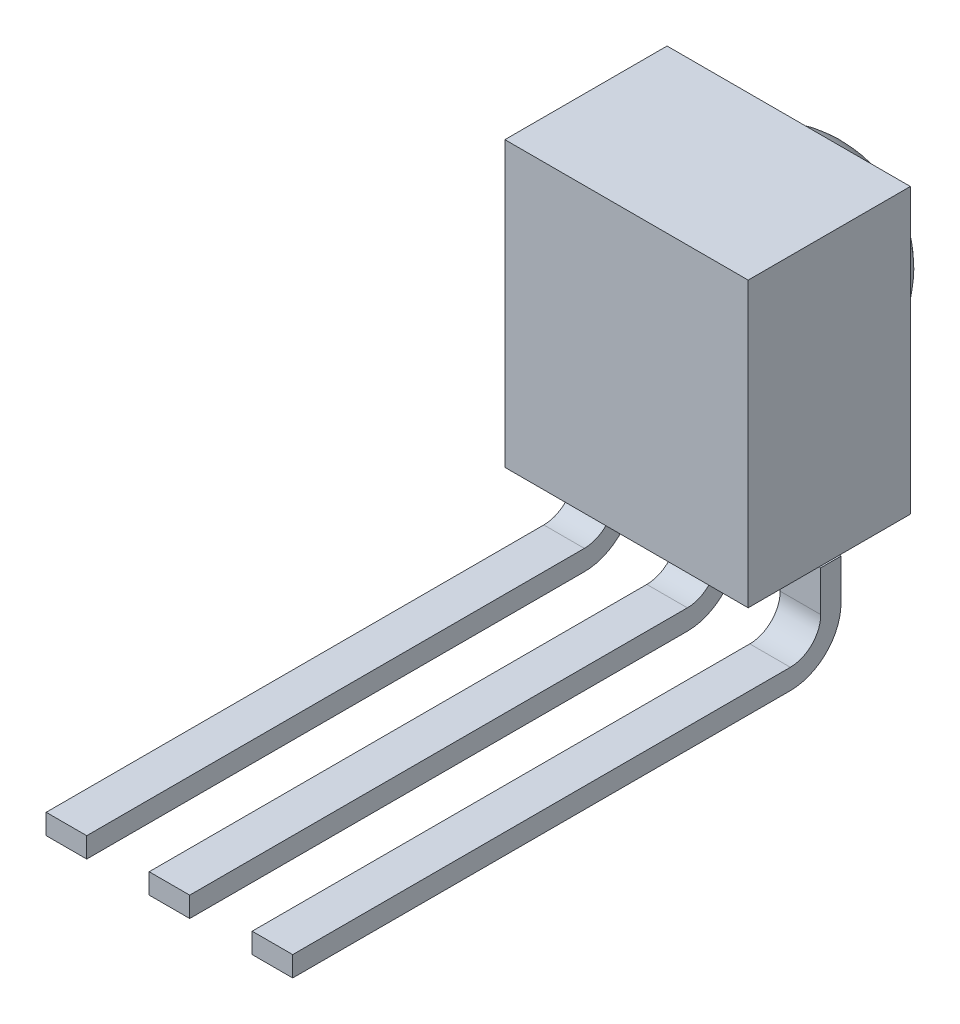
ISO-10303-21;
HEADER;
FILE_DESCRIPTION(('STEP AP214'),'2;1');
FILE_NAME('part.step','',(''),(''),'','','');
FILE_SCHEMA(('AUTOMOTIVE_DESIGN { 1 0 10303 214 1 1 1 1 }'));
ENDSEC;
DATA;
#1=APPLICATION_CONTEXT('core data for automotive mechanical design processes');
#2=APPLICATION_PROTOCOL_DEFINITION('international standard','automotive_design',2000,#1);
#3=PRODUCT_CONTEXT('',#1,'mechanical');
#4=PRODUCT('Part','Part','',(#3));
#5=PRODUCT_RELATED_PRODUCT_CATEGORY('part','',(#4));
#6=PRODUCT_DEFINITION_FORMATION('','',#4);
#7=PRODUCT_DEFINITION_CONTEXT('part definition',#1,'design');
#8=PRODUCT_DEFINITION('design','',#6,#7);
#9=PRODUCT_DEFINITION_SHAPE('','',#8);
#10=(LENGTH_UNIT() NAMED_UNIT(*) SI_UNIT(.MILLI.,.METRE.));
#11=(NAMED_UNIT(*) PLANE_ANGLE_UNIT() SI_UNIT($,.RADIAN.));
#12=(NAMED_UNIT(*) SI_UNIT($,.STERADIAN.) SOLID_ANGLE_UNIT());
#13=UNCERTAINTY_MEASURE_WITH_UNIT(LENGTH_MEASURE(1.E-05),#10,'distance_accuracy_value','');
#14=(GEOMETRIC_REPRESENTATION_CONTEXT(3) GLOBAL_UNCERTAINTY_ASSIGNED_CONTEXT((#13)) GLOBAL_UNIT_ASSIGNED_CONTEXT((#10,
#11,#12)) REPRESENTATION_CONTEXT('',''));
#15=CARTESIAN_POINT('',(0.,0.,0.));
#16=DIRECTION('',(0.,0.,1.));
#17=DIRECTION('',(1.,0.,0.));
#18=AXIS2_PLACEMENT_3D('',#15,#16,#17);
#19=CARTESIAN_POINT('',(-3.,0.,2.));
#20=DIRECTION('',(0.,1.,0.));
#21=DIRECTION('',(0.,0.,1.));
#22=AXIS2_PLACEMENT_3D('',#19,#20,#21);
#23=PLANE('',#22);
#24=DIRECTION('',(0.,0.,1.));
#25=VECTOR('',#24,1.);
#26=CARTESIAN_POINT('',(0.5,0.,0.25));
#27=LINE('',#26,#25);
#28=CARTESIAN_POINT('',(0.5,0.,-0.25));
#29=VERTEX_POINT('',#28);
#30=CARTESIAN_POINT('',(0.5,0.,0.25));
#31=VERTEX_POINT('',#30);
#32=EDGE_CURVE('E368',#29,#31,#27,.T.);
#33=ORIENTED_EDGE('',*,*,#32,.F.);
#34=DIRECTION('',(1.,0.,0.));
#35=VECTOR('',#34,1.);
#36=CARTESIAN_POINT('',(0.5,0.,-0.25));
#37=LINE('',#36,#35);
#38=CARTESIAN_POINT('',(-0.5,0.,-0.25));
#39=VERTEX_POINT('',#38);
#40=EDGE_CURVE('E373',#39,#29,#37,.T.);
#41=ORIENTED_EDGE('',*,*,#40,.F.);
#42=DIRECTION('',(0.,0.,-1.));
#43=VECTOR('',#42,1.);
#44=CARTESIAN_POINT('',(-0.5,0.,0.25));
#45=LINE('',#44,#43);
#46=CARTESIAN_POINT('',(-0.5,0.,0.25));
#47=VERTEX_POINT('',#46);
#48=EDGE_CURVE('E382',#47,#39,#45,.T.);
#49=ORIENTED_EDGE('',*,*,#48,.F.);
#50=DIRECTION('',(-1.,0.,0.));
#51=VECTOR('',#50,1.);
#52=CARTESIAN_POINT('',(0.5,0.,0.25));
#53=LINE('',#52,#51);
#54=EDGE_CURVE('E379',#31,#47,#53,.T.);
#55=ORIENTED_EDGE('',*,*,#54,.F.);
#56=EDGE_LOOP('',(#33,#41,#49,#55));
#57=FACE_BOUND('',#56,.T.);
#58=DIRECTION('',(-1.,0.,0.));
#59=VECTOR('',#58,1.);
#60=CARTESIAN_POINT('',(-3.04,0.,0.25));
#61=LINE('',#60,#59);
#62=CARTESIAN_POINT('',(-2.04,0.,0.25));
#63=VERTEX_POINT('',#62);
#64=CARTESIAN_POINT('',(-3.,0.,0.25));
#65=VERTEX_POINT('',#64);
#66=EDGE_CURVE('E50',#63,#65,#61,.T.);
#67=ORIENTED_EDGE('',*,*,#66,.F.);
#68=DIRECTION('',(0.,0.,1.));
#69=VECTOR('',#68,1.);
#70=CARTESIAN_POINT('',(-2.04,0.,0.25));
#71=LINE('',#70,#69);
#72=CARTESIAN_POINT('',(-2.04,0.,-0.25));
#73=VERTEX_POINT('',#72);
#74=EDGE_CURVE('E254',#73,#63,#71,.T.);
#75=ORIENTED_EDGE('',*,*,#74,.F.);
#76=DIRECTION('',(1.,0.,0.));
#77=VECTOR('',#76,1.);
#78=CARTESIAN_POINT('',(-3.04,0.,-0.25));
#79=LINE('',#78,#77);
#80=CARTESIAN_POINT('',(-3.,0.,-0.25));
#81=VERTEX_POINT('',#80);
#82=EDGE_CURVE('E537',#81,#73,#79,.T.);
#83=ORIENTED_EDGE('',*,*,#82,.F.);
#84=DIRECTION('',(0.,0.,1.));
#85=VECTOR('',#84,1.);
#86=CARTESIAN_POINT('',(-3.,0.,-2.));
#87=LINE('',#86,#85);
#88=CARTESIAN_POINT('',(-3.,0.,-2.));
#89=VERTEX_POINT('',#88);
#90=EDGE_CURVE('E441',#89,#81,#87,.T.);
#91=ORIENTED_EDGE('',*,*,#90,.F.);
#92=DIRECTION('',(-1.,0.,0.));
#93=VECTOR('',#92,1.);
#94=CARTESIAN_POINT('',(-3.,0.,-2.));
#95=LINE('',#94,#93);
#96=CARTESIAN_POINT('',(3.,0.,-2.));
#97=VERTEX_POINT('',#96);
#98=EDGE_CURVE('E451',#97,#89,#95,.T.);
#99=ORIENTED_EDGE('',*,*,#98,.F.);
#100=DIRECTION('',(0.,0.,-1.));
#101=VECTOR('',#100,1.);
#102=CARTESIAN_POINT('',(3.,0.,-2.));
#103=LINE('',#102,#101);
#104=CARTESIAN_POINT('',(3.,0.,-0.25));
#105=VERTEX_POINT('',#104);
#106=EDGE_CURVE('E447',#105,#97,#103,.T.);
#107=ORIENTED_EDGE('',*,*,#106,.F.);
#108=DIRECTION('',(1.,0.,0.));
#109=VECTOR('',#108,1.);
#110=CARTESIAN_POINT('',(3.04,0.,-0.25));
#111=LINE('',#110,#109);
#112=CARTESIAN_POINT('',(2.04,0.,-0.25));
#113=VERTEX_POINT('',#112);
#114=EDGE_CURVE('E58',#113,#105,#111,.T.);
#115=ORIENTED_EDGE('',*,*,#114,.F.);
#116=DIRECTION('',(0.,0.,-1.));
#117=VECTOR('',#116,1.);
#118=CARTESIAN_POINT('',(2.04,0.,0.25));
#119=LINE('',#118,#117);
#120=CARTESIAN_POINT('',(2.04,0.,0.25));
#121=VERTEX_POINT('',#120);
#122=EDGE_CURVE('E312',#121,#113,#119,.T.);
#123=ORIENTED_EDGE('',*,*,#122,.F.);
#124=DIRECTION('',(-1.,0.,0.));
#125=VECTOR('',#124,1.);
#126=CARTESIAN_POINT('',(3.04,0.,0.25));
#127=LINE('',#126,#125);
#128=CARTESIAN_POINT('',(3.,0.,0.25));
#129=VERTEX_POINT('',#128);
#130=EDGE_CURVE('E308',#129,#121,#127,.T.);
#131=ORIENTED_EDGE('',*,*,#130,.F.);
#132=CARTESIAN_POINT('',(3.,0.,2.));
#133=VERTEX_POINT('',#132);
#134=EDGE_CURVE('E448',#133,#129,#103,.T.);
#135=ORIENTED_EDGE('',*,*,#134,.F.);
#136=DIRECTION('',(1.,0.,0.));
#137=VECTOR('',#136,1.);
#138=CARTESIAN_POINT('',(-3.,0.,2.));
#139=LINE('',#138,#137);
#140=CARTESIAN_POINT('',(-3.,0.,2.));
#141=VERTEX_POINT('',#140);
#142=EDGE_CURVE('E444',#141,#133,#139,.T.);
#143=ORIENTED_EDGE('',*,*,#142,.F.);
#144=EDGE_CURVE('E440',#65,#141,#87,.T.);
#145=ORIENTED_EDGE('',*,*,#144,.F.);
#146=EDGE_LOOP('',(#67,#75,#83,#91,#99,#107,#115,#123,#131,#135,#143,#145));
#147=FACE_BOUND('',#146,.T.);
#148=ADVANCED_FACE('F35',(#57,#147),#23,.F.);
#149=CARTESIAN_POINT('',(-3.,7.,-2.));
#150=DIRECTION('',(0.,0.,1.));
#151=DIRECTION('',(1.,0.,0.));
#152=AXIS2_PLACEMENT_3D('',#149,#150,#151);
#153=PLANE('',#152);
#154=ORIENTED_EDGE('',*,*,#98,.T.);
#155=DIRECTION('',(0.,-1.,0.));
#156=VECTOR('',#155,1.);
#157=CARTESIAN_POINT('',(-3.,7.,-2.));
#158=LINE('',#157,#156);
#159=CARTESIAN_POINT('',(-3.,7.,-2.));
#160=VERTEX_POINT('',#159);
#161=EDGE_CURVE('E463',#160,#89,#158,.T.);
#162=ORIENTED_EDGE('',*,*,#161,.F.);
#163=DIRECTION('',(-1.,0.,0.));
#164=VECTOR('',#163,1.);
#165=CARTESIAN_POINT('',(-3.,7.,-2.));
#166=LINE('',#165,#164);
#167=CARTESIAN_POINT('',(3.,7.,-2.));
#168=VERTEX_POINT('',#167);
#169=EDGE_CURVE('E461',#168,#160,#166,.T.);
#170=ORIENTED_EDGE('',*,*,#169,.F.);
#171=DIRECTION('',(0.,-1.,0.));
#172=VECTOR('',#171,1.);
#173=CARTESIAN_POINT('',(3.,7.,-2.));
#174=LINE('',#173,#172);
#175=EDGE_CURVE('E466',#168,#97,#174,.T.);
#176=ORIENTED_EDGE('',*,*,#175,.T.);
#177=EDGE_LOOP('',(#154,#162,#170,#176));
#178=FACE_BOUND('',#177,.T.);
#179=CARTESIAN_POINT('',(0.,4.0409450285338,-2.));
#180=DIRECTION('',(0.,0.,1.));
#181=DIRECTION('',(1.,0.,0.));
#182=AXIS2_PLACEMENT_3D('',#179,#180,#181);
#183=CIRCLE('',#182,2.5);
#184=CARTESIAN_POINT('',(2.5,4.0409450285338,-2.));
#185=VERTEX_POINT('',#184);
#186=EDGE_CURVE('E43',#185,#185,#183,.F.);
#187=ORIENTED_EDGE('',*,*,#186,.F.);
#188=EDGE_LOOP('',(#187));
#189=FACE_BOUND('',#188,.T.);
#190=ADVANCED_FACE('F480',(#178,#189),#153,.F.);
#191=CARTESIAN_POINT('',(-3.,7.,-2.));
#192=DIRECTION('',(1.,0.,0.));
#193=DIRECTION('',(0.,0.,-1.));
#194=AXIS2_PLACEMENT_3D('',#191,#192,#193);
#195=PLANE('',#194);
#196=ORIENTED_EDGE('',*,*,#90,.T.);
#197=EDGE_CURVE('E445',#81,#65,#87,.T.);
#198=ORIENTED_EDGE('',*,*,#197,.T.);
#199=ORIENTED_EDGE('',*,*,#144,.T.);
#200=DIRECTION('',(0.,-1.,0.));
#201=VECTOR('',#200,1.);
#202=CARTESIAN_POINT('',(-3.,7.,2.));
#203=LINE('',#202,#201);
#204=CARTESIAN_POINT('',(-3.,7.,2.));
#205=VERTEX_POINT('',#204);
#206=EDGE_CURVE('E472',#205,#141,#203,.T.);
#207=ORIENTED_EDGE('',*,*,#206,.F.);
#208=DIRECTION('',(0.,0.,1.));
#209=VECTOR('',#208,1.);
#210=CARTESIAN_POINT('',(-3.,7.,-2.));
#211=LINE('',#210,#209);
#212=EDGE_CURVE('E454',#160,#205,#211,.T.);
#213=ORIENTED_EDGE('',*,*,#212,.F.);
#214=ORIENTED_EDGE('',*,*,#161,.T.);
#215=EDGE_LOOP('',(#196,#198,#199,#207,#213,#214));
#216=FACE_BOUND('',#215,.T.);
#217=ADVANCED_FACE('F37',(#216),#195,.F.);
#218=CARTESIAN_POINT('',(-3.,7.,2.));
#219=DIRECTION('',(0.,0.,-1.));
#220=DIRECTION('',(-1.,0.,0.));
#221=AXIS2_PLACEMENT_3D('',#218,#219,#220);
#222=PLANE('',#221);
#223=ORIENTED_EDGE('',*,*,#142,.T.);
#224=DIRECTION('',(0.,-1.,0.));
#225=VECTOR('',#224,1.);
#226=CARTESIAN_POINT('',(3.,7.,2.));
#227=LINE('',#226,#225);
#228=CARTESIAN_POINT('',(3.,7.,2.));
#229=VERTEX_POINT('',#228);
#230=EDGE_CURVE('E469',#229,#133,#227,.T.);
#231=ORIENTED_EDGE('',*,*,#230,.F.);
#232=DIRECTION('',(1.,0.,0.));
#233=VECTOR('',#232,1.);
#234=CARTESIAN_POINT('',(-3.,7.,2.));
#235=LINE('',#234,#233);
#236=EDGE_CURVE('E457',#205,#229,#235,.T.);
#237=ORIENTED_EDGE('',*,*,#236,.F.);
#238=ORIENTED_EDGE('',*,*,#206,.T.);
#239=EDGE_LOOP('',(#223,#231,#237,#238));
#240=FACE_BOUND('',#239,.T.);
#241=ADVANCED_FACE('F488',(#240),#222,.F.);
#242=CARTESIAN_POINT('',(3.,7.,-2.));
#243=DIRECTION('',(-1.,0.,0.));
#244=DIRECTION('',(0.,0.,1.));
#245=AXIS2_PLACEMENT_3D('',#242,#243,#244);
#246=PLANE('',#245);
#247=ORIENTED_EDGE('',*,*,#134,.T.);
#248=EDGE_CURVE('E452',#129,#105,#103,.T.);
#249=ORIENTED_EDGE('',*,*,#248,.T.);
#250=ORIENTED_EDGE('',*,*,#106,.T.);
#251=ORIENTED_EDGE('',*,*,#175,.F.);
#252=DIRECTION('',(0.,0.,-1.));
#253=VECTOR('',#252,1.);
#254=CARTESIAN_POINT('',(3.,7.,-2.));
#255=LINE('',#254,#253);
#256=EDGE_CURVE('E459',#229,#168,#255,.T.);
#257=ORIENTED_EDGE('',*,*,#256,.F.);
#258=ORIENTED_EDGE('',*,*,#230,.T.);
#259=EDGE_LOOP('',(#247,#249,#250,#251,#257,#258));
#260=FACE_BOUND('',#259,.T.);
#261=ADVANCED_FACE('F495',(#260),#246,.F.);
#262=CARTESIAN_POINT('',(-3.,7.,2.));
#263=DIRECTION('',(0.,1.,0.));
#264=DIRECTION('',(0.,0.,1.));
#265=AXIS2_PLACEMENT_3D('',#262,#263,#264);
#266=PLANE('',#265);
#267=ORIENTED_EDGE('',*,*,#212,.T.);
#268=ORIENTED_EDGE('',*,*,#236,.T.);
#269=ORIENTED_EDGE('',*,*,#256,.T.);
#270=ORIENTED_EDGE('',*,*,#169,.T.);
#271=EDGE_LOOP('',(#267,#268,#269,#270));
#272=FACE_BOUND('',#271,.T.);
#273=ADVANCED_FACE('F494',(#272),#266,.T.);
#274=CARTESIAN_POINT('',(0.,4.0409450285338,-4.));
#275=DIRECTION('',(0.,0.,-1.));
#276=DIRECTION('',(-1.,0.,0.));
#277=AXIS2_PLACEMENT_3D('',#274,#275,#276);
#278=PLANE('',#277);
#279=CARTESIAN_POINT('',(0.,4.0409450285338,-4.));
#280=DIRECTION('',(0.,0.,-1.));
#281=DIRECTION('',(-1.,0.,0.));
#282=AXIS2_PLACEMENT_3D('',#279,#280,#281);
#283=CIRCLE('',#282,0.0505102572168226);
#284=CARTESIAN_POINT('',(-0.0505102572168219,4.0409450285338,-4.));
#285=VERTEX_POINT('',#284);
#286=EDGE_CURVE('E11',#285,#285,#283,.T.);
#287=ORIENTED_EDGE('',*,*,#286,.T.);
#288=EDGE_LOOP('',(#287));
#289=FACE_BOUND('',#288,.T.);
#290=ADVANCED_FACE('F542',(#289),#278,.T.);
#291=CARTESIAN_POINT('',(0.,4.0409450285338,-1.5));
#292=DIRECTION('',(0.,0.,1.));
#293=DIRECTION('',(1.,0.,0.));
#294=AXIS2_PLACEMENT_3D('',#291,#292,#293);
#295=DEGENERATE_TOROIDAL_SURFACE('',#294,0.0505102572168226,2.5,.T.);
#296=ORIENTED_EDGE('',*,*,#186,.T.);
#297=EDGE_LOOP('',(#296));
#298=FACE_BOUND('',#297,.T.);
#299=ORIENTED_EDGE('',*,*,#286,.F.);
#300=EDGE_LOOP('',(#299));
#301=FACE_BOUND('',#300,.T.);
#302=ADVANCED_FACE('F477',(#298,#301),#295,.T.);
#303=CARTESIAN_POINT('',(0.5,-1.75,0.999999999999999));
#304=DIRECTION('',(0.,1.,0.));
#305=DIRECTION('',(-1.,0.,0.));
#306=AXIS2_PLACEMENT_3D('',#303,#304,#305);
#307=PLANE('',#306);
#308=DIRECTION('',(-1.,0.,0.));
#309=VECTOR('',#308,1.);
#310=CARTESIAN_POINT('',(0.5,-1.75,0.999999999999999));
#311=LINE('',#310,#309);
#312=CARTESIAN_POINT('',(0.5,-1.75,0.999999999999999));
#313=VERTEX_POINT('',#312);
#314=CARTESIAN_POINT('',(-0.5,-1.75,0.999999999999999));
#315=VERTEX_POINT('',#314);
#316=EDGE_CURVE('E401',#313,#315,#311,.T.);
#317=ORIENTED_EDGE('',*,*,#316,.T.);
#318=DIRECTION('',(0.,0.,1.));
#319=VECTOR('',#318,1.);
#320=CARTESIAN_POINT('',(-0.5,-1.75,0.999999999999999));
#321=LINE('',#320,#319);
#322=CARTESIAN_POINT('',(-0.5,-1.75,13.2732828552086));
#323=VERTEX_POINT('',#322);
#324=EDGE_CURVE('E434',#315,#323,#321,.T.);
#325=ORIENTED_EDGE('',*,*,#324,.T.);
#326=DIRECTION('',(-1.,0.,0.));
#327=VECTOR('',#326,1.);
#328=CARTESIAN_POINT('',(0.5,-1.75,13.2732828552086));
#329=LINE('',#328,#327);
#330=CARTESIAN_POINT('',(0.5,-1.75,13.2732828552086));
#331=VERTEX_POINT('',#330);
#332=EDGE_CURVE('E425',#331,#323,#329,.T.);
#333=ORIENTED_EDGE('',*,*,#332,.F.);
#334=DIRECTION('',(0.,0.,1.));
#335=VECTOR('',#334,1.);
#336=CARTESIAN_POINT('',(0.5,-1.75,0.999999999999999));
#337=LINE('',#336,#335);
#338=EDGE_CURVE('E437',#313,#331,#337,.T.);
#339=ORIENTED_EDGE('',*,*,#338,.F.);
#340=EDGE_LOOP('',(#317,#325,#333,#339));
#341=FACE_BOUND('',#340,.T.);
#342=ADVANCED_FACE('F551',(#341),#307,.T.);
#343=CARTESIAN_POINT('',(0.5,-2.25,0.999999999999999));
#344=DIRECTION('',(0.,-1.,0.));
#345=DIRECTION('',(0.,0.,-1.));
#346=AXIS2_PLACEMENT_3D('',#343,#344,#345);
#347=PLANE('',#346);
#348=DIRECTION('',(1.,0.,0.));
#349=VECTOR('',#348,1.);
#350=CARTESIAN_POINT('',(0.5,-2.25,0.999999999999999));
#351=LINE('',#350,#349);
#352=CARTESIAN_POINT('',(-0.5,-2.25,0.999999999999999));
#353=VERTEX_POINT('',#352);
#354=CARTESIAN_POINT('',(0.5,-2.25,0.999999999999999));
#355=VERTEX_POINT('',#354);
#356=EDGE_CURVE('E398',#353,#355,#351,.T.);
#357=ORIENTED_EDGE('',*,*,#356,.T.);
#358=DIRECTION('',(0.,0.,1.));
#359=VECTOR('',#358,1.);
#360=CARTESIAN_POINT('',(0.5,-2.25,0.999999999999999));
#361=LINE('',#360,#359);
#362=CARTESIAN_POINT('',(0.5,-2.25,13.2732828552086));
#363=VERTEX_POINT('',#362);
#364=EDGE_CURVE('E428',#355,#363,#361,.T.);
#365=ORIENTED_EDGE('',*,*,#364,.T.);
#366=DIRECTION('',(1.,0.,0.));
#367=VECTOR('',#366,1.);
#368=CARTESIAN_POINT('',(0.5,-2.25,13.2732828552086));
#369=LINE('',#368,#367);
#370=CARTESIAN_POINT('',(-0.5,-2.25,13.2732828552086));
#371=VERTEX_POINT('',#370);
#372=EDGE_CURVE('E419',#371,#363,#369,.T.);
#373=ORIENTED_EDGE('',*,*,#372,.F.);
#374=DIRECTION('',(0.,0.,1.));
#375=VECTOR('',#374,1.);
#376=CARTESIAN_POINT('',(-0.5,-2.25,0.999999999999999));
#377=LINE('',#376,#375);
#378=EDGE_CURVE('E431',#353,#371,#377,.T.);
#379=ORIENTED_EDGE('',*,*,#378,.F.);
#380=EDGE_LOOP('',(#357,#365,#373,#379));
#381=FACE_BOUND('',#380,.T.);
#382=ADVANCED_FACE('F556',(#381),#347,.T.);
#383=CARTESIAN_POINT('',(0.,-1.,1.));
#384=DIRECTION('',(-1.,0.,0.));
#385=DIRECTION('',(0.,0.,1.));
#386=AXIS2_PLACEMENT_3D('',#383,#384,#385);
#387=CYLINDRICAL_SURFACE('',#386,0.75);
#388=DIRECTION('',(-1.,0.,0.));
#389=VECTOR('',#388,1.);
#390=CARTESIAN_POINT('',(0.5,-1.,0.25));
#391=LINE('',#390,#389);
#392=CARTESIAN_POINT('',(0.5,-1.,0.25));
#393=VERTEX_POINT('',#392);
#394=CARTESIAN_POINT('',(-0.5,-1.,0.25));
#395=VERTEX_POINT('',#394);
#396=EDGE_CURVE('E369',#393,#395,#391,.T.);
#397=ORIENTED_EDGE('',*,*,#396,.T.);
#398=CARTESIAN_POINT('',(-0.5,-1.,1.));
#399=DIRECTION('',(-1.,0.,0.));
#400=DIRECTION('',(0.,0.,1.));
#401=AXIS2_PLACEMENT_3D('',#398,#399,#400);
#402=CIRCLE('',#401,0.75);
#403=EDGE_CURVE('E410',#395,#315,#402,.T.);
#404=ORIENTED_EDGE('',*,*,#403,.T.);
#405=ORIENTED_EDGE('',*,*,#316,.F.);
#406=CARTESIAN_POINT('',(0.5,-1.,1.));
#407=DIRECTION('',(-1.,0.,0.));
#408=DIRECTION('',(0.,0.,1.));
#409=AXIS2_PLACEMENT_3D('',#406,#407,#408);
#410=CIRCLE('',#409,0.75);
#411=EDGE_CURVE('E413',#393,#313,#410,.T.);
#412=ORIENTED_EDGE('',*,*,#411,.F.);
#413=EDGE_LOOP('',(#397,#404,#405,#412));
#414=FACE_BOUND('',#413,.T.);
#415=ADVANCED_FACE('F560',(#414),#387,.F.);
#416=CARTESIAN_POINT('',(0.,-1.,1.));
#417=DIRECTION('',(-1.,0.,0.));
#418=DIRECTION('',(0.,0.,1.));
#419=AXIS2_PLACEMENT_3D('',#416,#417,#418);
#420=CYLINDRICAL_SURFACE('',#419,1.25);
#421=DIRECTION('',(1.,0.,0.));
#422=VECTOR('',#421,1.);
#423=CARTESIAN_POINT('',(0.5,-1.,-0.25));
#424=LINE('',#423,#422);
#425=CARTESIAN_POINT('',(-0.5,-1.,-0.25));
#426=VERTEX_POINT('',#425);
#427=CARTESIAN_POINT('',(0.5,-1.,-0.25));
#428=VERTEX_POINT('',#427);
#429=EDGE_CURVE('E372',#426,#428,#424,.T.);
#430=ORIENTED_EDGE('',*,*,#429,.T.);
#431=CARTESIAN_POINT('',(0.5,-1.,1.));
#432=DIRECTION('',(-1.,0.,0.));
#433=DIRECTION('',(0.,0.,1.));
#434=AXIS2_PLACEMENT_3D('',#431,#432,#433);
#435=CIRCLE('',#434,1.25);
#436=EDGE_CURVE('E404',#428,#355,#435,.T.);
#437=ORIENTED_EDGE('',*,*,#436,.T.);
#438=ORIENTED_EDGE('',*,*,#356,.F.);
#439=CARTESIAN_POINT('',(-0.5,-1.,1.));
#440=DIRECTION('',(-1.,0.,0.));
#441=DIRECTION('',(0.,0.,1.));
#442=AXIS2_PLACEMENT_3D('',#439,#440,#441);
#443=CIRCLE('',#442,1.25);
#444=EDGE_CURVE('E407',#426,#353,#443,.T.);
#445=ORIENTED_EDGE('',*,*,#444,.F.);
#446=EDGE_LOOP('',(#430,#437,#438,#445));
#447=FACE_BOUND('',#446,.T.);
#448=ADVANCED_FACE('F564',(#447),#420,.T.);
#449=CARTESIAN_POINT('',(0.5,-1.,0.25));
#450=DIRECTION('',(-1.,0.,0.));
#451=DIRECTION('',(0.,0.,1.));
#452=AXIS2_PLACEMENT_3D('',#449,#450,#451);
#453=PLANE('',#452);
#454=ORIENTED_EDGE('',*,*,#32,.T.);
#455=DIRECTION('',(0.,1.,0.));
#456=VECTOR('',#455,1.);
#457=CARTESIAN_POINT('',(0.5,-1.,0.25));
#458=LINE('',#457,#456);
#459=EDGE_CURVE('E395',#393,#31,#458,.T.);
#460=ORIENTED_EDGE('',*,*,#459,.F.);
#461=ORIENTED_EDGE('',*,*,#411,.T.);
#462=ORIENTED_EDGE('',*,*,#338,.T.);
#463=DIRECTION('',(0.,1.,0.));
#464=VECTOR('',#463,1.);
#465=CARTESIAN_POINT('',(0.5,-1.75,13.2732828552086));
#466=LINE('',#465,#464);
#467=EDGE_CURVE('E416',#363,#331,#466,.T.);
#468=ORIENTED_EDGE('',*,*,#467,.F.);
#469=ORIENTED_EDGE('',*,*,#364,.F.);
#470=ORIENTED_EDGE('',*,*,#436,.F.);
#471=DIRECTION('',(0.,1.,0.));
#472=VECTOR('',#471,1.);
#473=CARTESIAN_POINT('',(0.5,-1.,-0.25));
#474=LINE('',#473,#472);
#475=EDGE_CURVE('E376',#428,#29,#474,.T.);
#476=ORIENTED_EDGE('',*,*,#475,.T.);
#477=EDGE_LOOP('',(#454,#460,#461,#462,#468,#469,#470,#476));
#478=FACE_BOUND('',#477,.T.);
#479=ADVANCED_FACE('F568',(#478),#453,.F.);
#480=CARTESIAN_POINT('',(0.5,-1.,0.25));
#481=DIRECTION('',(0.,0.,-1.));
#482=DIRECTION('',(0.,1.,0.));
#483=AXIS2_PLACEMENT_3D('',#480,#481,#482);
#484=PLANE('',#483);
#485=ORIENTED_EDGE('',*,*,#54,.T.);
#486=DIRECTION('',(0.,1.,0.));
#487=VECTOR('',#486,1.);
#488=CARTESIAN_POINT('',(-0.5,-1.,0.25));
#489=LINE('',#488,#487);
#490=EDGE_CURVE('E392',#395,#47,#489,.T.);
#491=ORIENTED_EDGE('',*,*,#490,.F.);
#492=ORIENTED_EDGE('',*,*,#396,.F.);
#493=ORIENTED_EDGE('',*,*,#459,.T.);
#494=EDGE_LOOP('',(#485,#491,#492,#493));
#495=FACE_BOUND('',#494,.T.);
#496=ADVANCED_FACE('F572',(#495),#484,.F.);
#497=CARTESIAN_POINT('',(-0.5,-1.,0.25));
#498=DIRECTION('',(1.,0.,0.));
#499=DIRECTION('',(0.,0.,-1.));
#500=AXIS2_PLACEMENT_3D('',#497,#498,#499);
#501=PLANE('',#500);
#502=ORIENTED_EDGE('',*,*,#48,.T.);
#503=DIRECTION('',(0.,1.,0.));
#504=VECTOR('',#503,1.);
#505=CARTESIAN_POINT('',(-0.5,-1.,-0.25));
#506=LINE('',#505,#504);
#507=EDGE_CURVE('E389',#426,#39,#506,.T.);
#508=ORIENTED_EDGE('',*,*,#507,.F.);
#509=ORIENTED_EDGE('',*,*,#444,.T.);
#510=ORIENTED_EDGE('',*,*,#378,.T.);
#511=DIRECTION('',(0.,-1.,0.));
#512=VECTOR('',#511,1.);
#513=CARTESIAN_POINT('',(-0.5,-1.75,13.2732828552086));
#514=LINE('',#513,#512);
#515=EDGE_CURVE('E422',#323,#371,#514,.T.);
#516=ORIENTED_EDGE('',*,*,#515,.F.);
#517=ORIENTED_EDGE('',*,*,#324,.F.);
#518=ORIENTED_EDGE('',*,*,#403,.F.);
#519=ORIENTED_EDGE('',*,*,#490,.T.);
#520=EDGE_LOOP('',(#502,#508,#509,#510,#516,#517,#518,#519));
#521=FACE_BOUND('',#520,.T.);
#522=ADVANCED_FACE('F576',(#521),#501,.F.);
#523=CARTESIAN_POINT('',(0.5,-1.,-0.25));
#524=DIRECTION('',(0.,0.,1.));
#525=DIRECTION('',(0.,-1.,0.));
#526=AXIS2_PLACEMENT_3D('',#523,#524,#525);
#527=PLANE('',#526);
#528=ORIENTED_EDGE('',*,*,#40,.T.);
#529=ORIENTED_EDGE('',*,*,#475,.F.);
#530=ORIENTED_EDGE('',*,*,#429,.F.);
#531=ORIENTED_EDGE('',*,*,#507,.T.);
#532=EDGE_LOOP('',(#528,#529,#530,#531));
#533=FACE_BOUND('',#532,.T.);
#534=ADVANCED_FACE('F580',(#533),#527,.F.);
#535=CARTESIAN_POINT('',(0.5,-2.25,13.2732828552086));
#536=DIRECTION('',(0.,0.,-1.));
#537=DIRECTION('',(0.,1.,0.));
#538=AXIS2_PLACEMENT_3D('',#535,#536,#537);
#539=PLANE('',#538);
#540=ORIENTED_EDGE('',*,*,#467,.T.);
#541=ORIENTED_EDGE('',*,*,#332,.T.);
#542=ORIENTED_EDGE('',*,*,#515,.T.);
#543=ORIENTED_EDGE('',*,*,#372,.T.);
#544=EDGE_LOOP('',(#540,#541,#542,#543));
#545=FACE_BOUND('',#544,.T.);
#546=ADVANCED_FACE('F584',(#545),#539,.F.);
#547=CARTESIAN_POINT('',(3.04,0.,-0.25));
#548=DIRECTION('',(0.,1.,0.));
#549=DIRECTION('',(0.,0.,1.));
#550=AXIS2_PLACEMENT_3D('',#547,#548,#549);
#551=PLANE('',#550);
#552=ORIENTED_EDGE('',*,*,#248,.F.);
#553=CARTESIAN_POINT('',(3.04,0.,0.25));
#554=VERTEX_POINT('',#553);
#555=EDGE_CURVE('E309',#554,#129,#127,.T.);
#556=ORIENTED_EDGE('',*,*,#555,.F.);
#557=DIRECTION('',(0.,0.,1.));
#558=VECTOR('',#557,1.);
#559=CARTESIAN_POINT('',(3.04,0.,0.25));
#560=LINE('',#559,#558);
#561=CARTESIAN_POINT('',(3.04,0.,-0.25));
#562=VERTEX_POINT('',#561);
#563=EDGE_CURVE('E298',#562,#554,#560,.T.);
#564=ORIENTED_EDGE('',*,*,#563,.F.);
#565=EDGE_CURVE('E314',#105,#562,#111,.T.);
#566=ORIENTED_EDGE('',*,*,#565,.F.);
#567=EDGE_LOOP('',(#552,#556,#564,#566));
#568=FACE_BOUND('',#567,.T.);
#569=ADVANCED_FACE('F529',(#568),#551,.T.);
#570=CARTESIAN_POINT('',(3.04,-1.75,0.999999999999999));
#571=DIRECTION('',(0.,1.,0.));
#572=DIRECTION('',(-1.,0.,0.));
#573=AXIS2_PLACEMENT_3D('',#570,#571,#572);
#574=PLANE('',#573);
#575=DIRECTION('',(-1.,0.,0.));
#576=VECTOR('',#575,1.);
#577=CARTESIAN_POINT('',(3.04,-1.75,0.999999999999999));
#578=LINE('',#577,#576);
#579=CARTESIAN_POINT('',(3.04,-1.75,0.999999999999999));
#580=VERTEX_POINT('',#579);
#581=CARTESIAN_POINT('',(2.04,-1.75,0.999999999999999));
#582=VERTEX_POINT('',#581);
#583=EDGE_CURVE('E329',#580,#582,#578,.T.);
#584=ORIENTED_EDGE('',*,*,#583,.T.);
#585=DIRECTION('',(0.,0.,1.));
#586=VECTOR('',#585,1.);
#587=CARTESIAN_POINT('',(2.04,-1.75,0.999999999999999));
#588=LINE('',#587,#586);
#589=CARTESIAN_POINT('',(2.04,-1.75,13.2732828552086));
#590=VERTEX_POINT('',#589);
#591=EDGE_CURVE('E362',#582,#590,#588,.T.);
#592=ORIENTED_EDGE('',*,*,#591,.T.);
#593=DIRECTION('',(-1.,0.,0.));
#594=VECTOR('',#593,1.);
#595=CARTESIAN_POINT('',(3.04,-1.75,13.2732828552086));
#596=LINE('',#595,#594);
#597=CARTESIAN_POINT('',(3.04,-1.75,13.2732828552086));
#598=VERTEX_POINT('',#597);
#599=EDGE_CURVE('E353',#598,#590,#596,.T.);
#600=ORIENTED_EDGE('',*,*,#599,.F.);
#601=DIRECTION('',(0.,0.,1.));
#602=VECTOR('',#601,1.);
#603=CARTESIAN_POINT('',(3.04,-1.75,0.999999999999999));
#604=LINE('',#603,#602);
#605=EDGE_CURVE('E365',#580,#598,#604,.T.);
#606=ORIENTED_EDGE('',*,*,#605,.F.);
#607=EDGE_LOOP('',(#584,#592,#600,#606));
#608=FACE_BOUND('',#607,.T.);
#609=ADVANCED_FACE('F589',(#608),#574,.T.);
#610=CARTESIAN_POINT('',(3.04,-2.25,0.999999999999999));
#611=DIRECTION('',(0.,-1.,0.));
#612=DIRECTION('',(0.,0.,-1.));
#613=AXIS2_PLACEMENT_3D('',#610,#611,#612);
#614=PLANE('',#613);
#615=DIRECTION('',(1.,0.,0.));
#616=VECTOR('',#615,1.);
#617=CARTESIAN_POINT('',(3.04,-2.25,0.999999999999999));
#618=LINE('',#617,#616);
#619=CARTESIAN_POINT('',(2.04,-2.25,0.999999999999999));
#620=VERTEX_POINT('',#619);
#621=CARTESIAN_POINT('',(3.04,-2.25,0.999999999999999));
#622=VERTEX_POINT('',#621);
#623=EDGE_CURVE('E326',#620,#622,#618,.T.);
#624=ORIENTED_EDGE('',*,*,#623,.T.);
#625=DIRECTION('',(0.,0.,1.));
#626=VECTOR('',#625,1.);
#627=CARTESIAN_POINT('',(3.04,-2.25,0.999999999999999));
#628=LINE('',#627,#626);
#629=CARTESIAN_POINT('',(3.04,-2.25,13.2732828552086));
#630=VERTEX_POINT('',#629);
#631=EDGE_CURVE('E356',#622,#630,#628,.T.);
#632=ORIENTED_EDGE('',*,*,#631,.T.);
#633=DIRECTION('',(1.,0.,0.));
#634=VECTOR('',#633,1.);
#635=CARTESIAN_POINT('',(3.04,-2.25,13.2732828552086));
#636=LINE('',#635,#634);
#637=CARTESIAN_POINT('',(2.04,-2.25,13.2732828552086));
#638=VERTEX_POINT('',#637);
#639=EDGE_CURVE('E347',#638,#630,#636,.T.);
#640=ORIENTED_EDGE('',*,*,#639,.F.);
#641=DIRECTION('',(0.,0.,1.));
#642=VECTOR('',#641,1.);
#643=CARTESIAN_POINT('',(2.04,-2.25,0.999999999999999));
#644=LINE('',#643,#642);
#645=EDGE_CURVE('E359',#620,#638,#644,.T.);
#646=ORIENTED_EDGE('',*,*,#645,.F.);
#647=EDGE_LOOP('',(#624,#632,#640,#646));
#648=FACE_BOUND('',#647,.T.);
#649=ADVANCED_FACE('F592',(#648),#614,.T.);
#650=CARTESIAN_POINT('',(0.,-1.,1.));
#651=DIRECTION('',(-1.,0.,0.));
#652=DIRECTION('',(0.,0.,1.));
#653=AXIS2_PLACEMENT_3D('',#650,#651,#652);
#654=CYLINDRICAL_SURFACE('',#653,0.75);
#655=DIRECTION('',(-1.,0.,0.));
#656=VECTOR('',#655,1.);
#657=CARTESIAN_POINT('',(3.04,-1.,0.25));
#658=LINE('',#657,#656);
#659=CARTESIAN_POINT('',(3.04,-1.,0.25));
#660=VERTEX_POINT('',#659);
#661=CARTESIAN_POINT('',(2.04,-1.,0.25));
#662=VERTEX_POINT('',#661);
#663=EDGE_CURVE('E299',#660,#662,#658,.T.);
#664=ORIENTED_EDGE('',*,*,#663,.T.);
#665=CARTESIAN_POINT('',(2.04,-1.,1.));
#666=DIRECTION('',(-1.,0.,0.));
#667=DIRECTION('',(0.,0.,1.));
#668=AXIS2_PLACEMENT_3D('',#665,#666,#667);
#669=CIRCLE('',#668,0.75);
#670=EDGE_CURVE('E338',#662,#582,#669,.T.);
#671=ORIENTED_EDGE('',*,*,#670,.T.);
#672=ORIENTED_EDGE('',*,*,#583,.F.);
#673=CARTESIAN_POINT('',(3.04,-1.,1.));
#674=DIRECTION('',(-1.,0.,0.));
#675=DIRECTION('',(0.,0.,1.));
#676=AXIS2_PLACEMENT_3D('',#673,#674,#675);
#677=CIRCLE('',#676,0.75);
#678=EDGE_CURVE('E341',#660,#580,#677,.T.);
#679=ORIENTED_EDGE('',*,*,#678,.F.);
#680=EDGE_LOOP('',(#664,#671,#672,#679));
#681=FACE_BOUND('',#680,.T.);
#682=ADVANCED_FACE('F522',(#681),#654,.F.);
#683=CARTESIAN_POINT('',(0.,-1.,1.));
#684=DIRECTION('',(-1.,0.,0.));
#685=DIRECTION('',(0.,0.,1.));
#686=AXIS2_PLACEMENT_3D('',#683,#684,#685);
#687=CYLINDRICAL_SURFACE('',#686,1.25);
#688=DIRECTION('',(1.,0.,0.));
#689=VECTOR('',#688,1.);
#690=CARTESIAN_POINT('',(3.04,-1.,-0.25));
#691=LINE('',#690,#689);
#692=CARTESIAN_POINT('',(2.04,-1.,-0.25));
#693=VERTEX_POINT('',#692);
#694=CARTESIAN_POINT('',(3.04,-1.,-0.25));
#695=VERTEX_POINT('',#694);
#696=EDGE_CURVE('E302',#693,#695,#691,.T.);
#697=ORIENTED_EDGE('',*,*,#696,.T.);
#698=CARTESIAN_POINT('',(3.04,-1.,1.));
#699=DIRECTION('',(-1.,0.,0.));
#700=DIRECTION('',(0.,0.,1.));
#701=AXIS2_PLACEMENT_3D('',#698,#699,#700);
#702=CIRCLE('',#701,1.25);
#703=EDGE_CURVE('E332',#695,#622,#702,.T.);
#704=ORIENTED_EDGE('',*,*,#703,.T.);
#705=ORIENTED_EDGE('',*,*,#623,.F.);
#706=CARTESIAN_POINT('',(2.04,-1.,1.));
#707=DIRECTION('',(-1.,0.,0.));
#708=DIRECTION('',(0.,0.,1.));
#709=AXIS2_PLACEMENT_3D('',#706,#707,#708);
#710=CIRCLE('',#709,1.25);
#711=EDGE_CURVE('E335',#693,#620,#710,.T.);
#712=ORIENTED_EDGE('',*,*,#711,.F.);
#713=EDGE_LOOP('',(#697,#704,#705,#712));
#714=FACE_BOUND('',#713,.T.);
#715=ADVANCED_FACE('F599',(#714),#687,.T.);
#716=CARTESIAN_POINT('',(3.04,-1.,0.25));
#717=DIRECTION('',(-1.,0.,0.));
#718=DIRECTION('',(0.,0.,1.));
#719=AXIS2_PLACEMENT_3D('',#716,#717,#718);
#720=PLANE('',#719);
#721=ORIENTED_EDGE('',*,*,#563,.T.);
#722=DIRECTION('',(0.,1.,0.));
#723=VECTOR('',#722,1.);
#724=CARTESIAN_POINT('',(3.04,-1.,0.25));
#725=LINE('',#724,#723);
#726=EDGE_CURVE('E323',#660,#554,#725,.T.);
#727=ORIENTED_EDGE('',*,*,#726,.F.);
#728=ORIENTED_EDGE('',*,*,#678,.T.);
#729=ORIENTED_EDGE('',*,*,#605,.T.);
#730=DIRECTION('',(0.,1.,0.));
#731=VECTOR('',#730,1.);
#732=CARTESIAN_POINT('',(3.04,-1.75,13.2732828552086));
#733=LINE('',#732,#731);
#734=EDGE_CURVE('E344',#630,#598,#733,.T.);
#735=ORIENTED_EDGE('',*,*,#734,.F.);
#736=ORIENTED_EDGE('',*,*,#631,.F.);
#737=ORIENTED_EDGE('',*,*,#703,.F.);
#738=DIRECTION('',(0.,1.,0.));
#739=VECTOR('',#738,1.);
#740=CARTESIAN_POINT('',(3.04,-1.,-0.25));
#741=LINE('',#740,#739);
#742=EDGE_CURVE('E305',#695,#562,#741,.T.);
#743=ORIENTED_EDGE('',*,*,#742,.T.);
#744=EDGE_LOOP('',(#721,#727,#728,#729,#735,#736,#737,#743));
#745=FACE_BOUND('',#744,.T.);
#746=ADVANCED_FACE('F525',(#745),#720,.F.);
#747=CARTESIAN_POINT('',(3.04,-1.,0.25));
#748=DIRECTION('',(0.,0.,-1.));
#749=DIRECTION('',(0.,1.,0.));
#750=AXIS2_PLACEMENT_3D('',#747,#748,#749);
#751=PLANE('',#750);
#752=ORIENTED_EDGE('',*,*,#555,.T.);
#753=ORIENTED_EDGE('',*,*,#130,.T.);
#754=DIRECTION('',(0.,1.,0.));
#755=VECTOR('',#754,1.);
#756=CARTESIAN_POINT('',(2.04,-1.,0.25));
#757=LINE('',#756,#755);
#758=EDGE_CURVE('E320',#662,#121,#757,.T.);
#759=ORIENTED_EDGE('',*,*,#758,.F.);
#760=ORIENTED_EDGE('',*,*,#663,.F.);
#761=ORIENTED_EDGE('',*,*,#726,.T.);
#762=EDGE_LOOP('',(#752,#753,#759,#760,#761));
#763=FACE_BOUND('',#762,.T.);
#764=ADVANCED_FACE('F515',(#763),#751,.F.);
#765=CARTESIAN_POINT('',(2.04,-1.,0.25));
#766=DIRECTION('',(1.,0.,0.));
#767=DIRECTION('',(0.,0.,-1.));
#768=AXIS2_PLACEMENT_3D('',#765,#766,#767);
#769=PLANE('',#768);
#770=ORIENTED_EDGE('',*,*,#122,.T.);
#771=DIRECTION('',(0.,1.,0.));
#772=VECTOR('',#771,1.);
#773=CARTESIAN_POINT('',(2.04,-1.,-0.25));
#774=LINE('',#773,#772);
#775=EDGE_CURVE('E318',#693,#113,#774,.T.);
#776=ORIENTED_EDGE('',*,*,#775,.F.);
#777=ORIENTED_EDGE('',*,*,#711,.T.);
#778=ORIENTED_EDGE('',*,*,#645,.T.);
#779=DIRECTION('',(0.,-1.,0.));
#780=VECTOR('',#779,1.);
#781=CARTESIAN_POINT('',(2.04,-1.75,13.2732828552086));
#782=LINE('',#781,#780);
#783=EDGE_CURVE('E350',#590,#638,#782,.T.);
#784=ORIENTED_EDGE('',*,*,#783,.F.);
#785=ORIENTED_EDGE('',*,*,#591,.F.);
#786=ORIENTED_EDGE('',*,*,#670,.F.);
#787=ORIENTED_EDGE('',*,*,#758,.T.);
#788=EDGE_LOOP('',(#770,#776,#777,#778,#784,#785,#786,#787));
#789=FACE_BOUND('',#788,.T.);
#790=ADVANCED_FACE('F518',(#789),#769,.F.);
#791=CARTESIAN_POINT('',(3.04,-1.,-0.25));
#792=DIRECTION('',(0.,0.,1.));
#793=DIRECTION('',(0.,-1.,0.));
#794=AXIS2_PLACEMENT_3D('',#791,#792,#793);
#795=PLANE('',#794);
#796=ORIENTED_EDGE('',*,*,#114,.T.);
#797=ORIENTED_EDGE('',*,*,#565,.T.);
#798=ORIENTED_EDGE('',*,*,#742,.F.);
#799=ORIENTED_EDGE('',*,*,#696,.F.);
#800=ORIENTED_EDGE('',*,*,#775,.T.);
#801=EDGE_LOOP('',(#796,#797,#798,#799,#800));
#802=FACE_BOUND('',#801,.T.);
#803=ADVANCED_FACE('F609',(#802),#795,.F.);
#804=CARTESIAN_POINT('',(3.04,-2.25,13.2732828552086));
#805=DIRECTION('',(0.,0.,-1.));
#806=DIRECTION('',(0.,1.,0.));
#807=AXIS2_PLACEMENT_3D('',#804,#805,#806);
#808=PLANE('',#807);
#809=ORIENTED_EDGE('',*,*,#734,.T.);
#810=ORIENTED_EDGE('',*,*,#599,.T.);
#811=ORIENTED_EDGE('',*,*,#783,.T.);
#812=ORIENTED_EDGE('',*,*,#639,.T.);
#813=EDGE_LOOP('',(#809,#810,#811,#812));
#814=FACE_BOUND('',#813,.T.);
#815=ADVANCED_FACE('F612',(#814),#808,.F.);
#816=CARTESIAN_POINT('',(-2.04,0.,0.25));
#817=DIRECTION('',(0.,1.,0.));
#818=DIRECTION('',(0.,0.,1.));
#819=AXIS2_PLACEMENT_3D('',#816,#817,#818);
#820=PLANE('',#819);
#821=ORIENTED_EDGE('',*,*,#197,.F.);
#822=CARTESIAN_POINT('',(-3.04,0.,-0.25));
#823=VERTEX_POINT('',#822);
#824=EDGE_CURVE('E660',#823,#81,#79,.T.);
#825=ORIENTED_EDGE('',*,*,#824,.F.);
#826=DIRECTION('',(0.,0.,-1.));
#827=VECTOR('',#826,1.);
#828=CARTESIAN_POINT('',(-3.04,0.,0.25));
#829=LINE('',#828,#827);
#830=CARTESIAN_POINT('',(-3.04,0.,0.25));
#831=VERTEX_POINT('',#830);
#832=EDGE_CURVE('E663',#831,#823,#829,.T.);
#833=ORIENTED_EDGE('',*,*,#832,.F.);
#834=EDGE_CURVE('E257',#65,#831,#61,.T.);
#835=ORIENTED_EDGE('',*,*,#834,.F.);
#836=EDGE_LOOP('',(#821,#825,#833,#835));
#837=FACE_BOUND('',#836,.T.);
#838=ADVANCED_FACE('F617',(#837),#820,.T.);
#839=CARTESIAN_POINT('',(-3.04,-2.25,0.999999999999999));
#840=DIRECTION('',(0.,-1.,0.));
#841=DIRECTION('',(0.,0.,-1.));
#842=AXIS2_PLACEMENT_3D('',#839,#840,#841);
#843=PLANE('',#842);
#844=DIRECTION('',(1.,0.,0.));
#845=VECTOR('',#844,1.);
#846=CARTESIAN_POINT('',(-3.04,-2.25,0.999999999999999));
#847=LINE('',#846,#845);
#848=CARTESIAN_POINT('',(-3.04,-2.25,0.999999999999999));
#849=VERTEX_POINT('',#848);
#850=CARTESIAN_POINT('',(-2.04,-2.25,0.999999999999999));
#851=VERTEX_POINT('',#850);
#852=EDGE_CURVE('E262',#849,#851,#847,.T.);
#853=ORIENTED_EDGE('',*,*,#852,.T.);
#854=DIRECTION('',(0.,0.,1.));
#855=VECTOR('',#854,1.);
#856=CARTESIAN_POINT('',(-2.04,-2.25,0.999999999999999));
#857=LINE('',#856,#855);
#858=CARTESIAN_POINT('',(-2.04,-2.25,13.2732828552086));
#859=VERTEX_POINT('',#858);
#860=EDGE_CURVE('E291',#851,#859,#857,.T.);
#861=ORIENTED_EDGE('',*,*,#860,.T.);
#862=DIRECTION('',(1.,0.,0.));
#863=VECTOR('',#862,1.);
#864=CARTESIAN_POINT('',(-3.04,-2.25,13.2732828552086));
#865=LINE('',#864,#863);
#866=CARTESIAN_POINT('',(-3.04,-2.25,13.2732828552086));
#867=VERTEX_POINT('',#866);
#868=EDGE_CURVE('E282',#867,#859,#865,.T.);
#869=ORIENTED_EDGE('',*,*,#868,.F.);
#870=DIRECTION('',(0.,0.,1.));
#871=VECTOR('',#870,1.);
#872=CARTESIAN_POINT('',(-3.04,-2.25,0.999999999999999));
#873=LINE('',#872,#871);
#874=EDGE_CURVE('E294',#849,#867,#873,.T.);
#875=ORIENTED_EDGE('',*,*,#874,.F.);
#876=EDGE_LOOP('',(#853,#861,#869,#875));
#877=FACE_BOUND('',#876,.T.);
#878=ADVANCED_FACE('F619',(#877),#843,.T.);
#879=CARTESIAN_POINT('',(-3.04,-1.75,0.999999999999999));
#880=DIRECTION('',(0.,1.,0.));
#881=DIRECTION('',(-1.,0.,0.));
#882=AXIS2_PLACEMENT_3D('',#879,#880,#881);
#883=PLANE('',#882);
#884=DIRECTION('',(-1.,0.,0.));
#885=VECTOR('',#884,1.);
#886=CARTESIAN_POINT('',(-3.04,-1.75,0.999999999999999));
#887=LINE('',#886,#885);
#888=CARTESIAN_POINT('',(-2.04,-1.75,0.999999999999999));
#889=VERTEX_POINT('',#888);
#890=CARTESIAN_POINT('',(-3.04,-1.75,0.999999999999999));
#891=VERTEX_POINT('',#890);
#892=EDGE_CURVE('E259',#889,#891,#887,.T.);
#893=ORIENTED_EDGE('',*,*,#892,.T.);
#894=DIRECTION('',(0.,0.,1.));
#895=VECTOR('',#894,1.);
#896=CARTESIAN_POINT('',(-3.04,-1.75,0.999999999999999));
#897=LINE('',#896,#895);
#898=CARTESIAN_POINT('',(-3.04,-1.75,13.2732828552086));
#899=VERTEX_POINT('',#898);
#900=EDGE_CURVE('E240',#891,#899,#897,.T.);
#901=ORIENTED_EDGE('',*,*,#900,.T.);
#902=DIRECTION('',(-1.,0.,0.));
#903=VECTOR('',#902,1.);
#904=CARTESIAN_POINT('',(-3.04,-1.75,13.2732828552086));
#905=LINE('',#904,#903);
#906=CARTESIAN_POINT('',(-2.04,-1.75,13.2732828552086));
#907=VERTEX_POINT('',#906);
#908=EDGE_CURVE('E244',#907,#899,#905,.T.);
#909=ORIENTED_EDGE('',*,*,#908,.F.);
#910=DIRECTION('',(0.,0.,1.));
#911=VECTOR('',#910,1.);
#912=CARTESIAN_POINT('',(-2.04,-1.75,0.999999999999999));
#913=LINE('',#912,#911);
#914=EDGE_CURVE('E288',#889,#907,#913,.T.);
#915=ORIENTED_EDGE('',*,*,#914,.F.);
#916=EDGE_LOOP('',(#893,#901,#909,#915));
#917=FACE_BOUND('',#916,.T.);
#918=ADVANCED_FACE('F622',(#917),#883,.T.);
#919=CARTESIAN_POINT('',(0.,-1.,1.));
#920=DIRECTION('',(-1.,0.,0.));
#921=DIRECTION('',(0.,0.,1.));
#922=AXIS2_PLACEMENT_3D('',#919,#920,#921);
#923=CYLINDRICAL_SURFACE('',#922,1.25);
#924=DIRECTION('',(1.,0.,0.));
#925=VECTOR('',#924,1.);
#926=CARTESIAN_POINT('',(-3.04,-1.,-0.25));
#927=LINE('',#926,#925);
#928=CARTESIAN_POINT('',(-3.04,-1.,-0.25));
#929=VERTEX_POINT('',#928);
#930=CARTESIAN_POINT('',(-2.04,-1.,-0.25));
#931=VERTEX_POINT('',#930);
#932=EDGE_CURVE('E253',#929,#931,#927,.T.);
#933=ORIENTED_EDGE('',*,*,#932,.T.);
#934=CARTESIAN_POINT('',(-2.04,-1.,1.));
#935=DIRECTION('',(-1.,0.,0.));
#936=DIRECTION('',(0.,0.,1.));
#937=AXIS2_PLACEMENT_3D('',#934,#935,#936);
#938=CIRCLE('',#937,1.25);
#939=EDGE_CURVE('E272',#931,#851,#938,.T.);
#940=ORIENTED_EDGE('',*,*,#939,.T.);
#941=ORIENTED_EDGE('',*,*,#852,.F.);
#942=CARTESIAN_POINT('',(-3.04,-1.,1.));
#943=DIRECTION('',(-1.,0.,0.));
#944=DIRECTION('',(0.,0.,1.));
#945=AXIS2_PLACEMENT_3D('',#942,#943,#944);
#946=CIRCLE('',#945,1.25);
#947=EDGE_CURVE('E245',#929,#849,#946,.T.);
#948=ORIENTED_EDGE('',*,*,#947,.F.);
#949=EDGE_LOOP('',(#933,#940,#941,#948));
#950=FACE_BOUND('',#949,.T.);
#951=ADVANCED_FACE('F626',(#950),#923,.T.);
#952=CARTESIAN_POINT('',(0.,-1.,1.));
#953=DIRECTION('',(-1.,0.,0.));
#954=DIRECTION('',(0.,0.,1.));
#955=AXIS2_PLACEMENT_3D('',#952,#953,#954);
#956=CYLINDRICAL_SURFACE('',#955,0.75);
#957=DIRECTION('',(-1.,0.,0.));
#958=VECTOR('',#957,1.);
#959=CARTESIAN_POINT('',(-3.04,-1.,0.25));
#960=LINE('',#959,#958);
#961=CARTESIAN_POINT('',(-2.04,-1.,0.25));
#962=VERTEX_POINT('',#961);
#963=CARTESIAN_POINT('',(-3.04,-1.,0.25));
#964=VERTEX_POINT('',#963);
#965=EDGE_CURVE('E248',#962,#964,#960,.T.);
#966=ORIENTED_EDGE('',*,*,#965,.T.);
#967=CARTESIAN_POINT('',(-3.04,-1.,1.));
#968=DIRECTION('',(-1.,0.,0.));
#969=DIRECTION('',(0.,0.,1.));
#970=AXIS2_PLACEMENT_3D('',#967,#968,#969);
#971=CIRCLE('',#970,0.75);
#972=EDGE_CURVE('E234',#964,#891,#971,.T.);
#973=ORIENTED_EDGE('',*,*,#972,.T.);
#974=ORIENTED_EDGE('',*,*,#892,.F.);
#975=CARTESIAN_POINT('',(-2.04,-1.,1.));
#976=DIRECTION('',(-1.,0.,0.));
#977=DIRECTION('',(0.,0.,1.));
#978=AXIS2_PLACEMENT_3D('',#975,#976,#977);
#979=CIRCLE('',#978,0.75);
#980=EDGE_CURVE('E251',#962,#889,#979,.T.);
#981=ORIENTED_EDGE('',*,*,#980,.F.);
#982=EDGE_LOOP('',(#966,#973,#974,#981));
#983=FACE_BOUND('',#982,.T.);
#984=ADVANCED_FACE('F249',(#983),#956,.F.);
#985=CARTESIAN_POINT('',(-3.04,-1.,0.25));
#986=DIRECTION('',(0.,0.,-1.));
#987=DIRECTION('',(0.,1.,0.));
#988=AXIS2_PLACEMENT_3D('',#985,#986,#987);
#989=PLANE('',#988);
#990=ORIENTED_EDGE('',*,*,#66,.T.);
#991=ORIENTED_EDGE('',*,*,#834,.T.);
#992=DIRECTION('',(0.,1.,0.));
#993=VECTOR('',#992,1.);
#994=CARTESIAN_POINT('',(-3.04,-1.,0.25));
#995=LINE('',#994,#993);
#996=EDGE_CURVE('E238',#964,#831,#995,.T.);
#997=ORIENTED_EDGE('',*,*,#996,.F.);
#998=ORIENTED_EDGE('',*,*,#965,.F.);
#999=DIRECTION('',(0.,1.,0.));
#1000=VECTOR('',#999,1.);
#1001=CARTESIAN_POINT('',(-2.04,-1.,0.25));
#1002=LINE('',#1001,#1000);
#1003=EDGE_CURVE('E653',#962,#63,#1002,.T.);
#1004=ORIENTED_EDGE('',*,*,#1003,.T.);
#1005=EDGE_LOOP('',(#990,#991,#997,#998,#1004));
#1006=FACE_BOUND('',#1005,.T.);
#1007=ADVANCED_FACE('F256',(#1006),#989,.F.);
#1008=CARTESIAN_POINT('',(-3.04,-1.,0.25));
#1009=DIRECTION('',(1.,0.,0.));
#1010=DIRECTION('',(0.,0.,-1.));
#1011=AXIS2_PLACEMENT_3D('',#1008,#1009,#1010);
#1012=PLANE('',#1011);
#1013=ORIENTED_EDGE('',*,*,#832,.T.);
#1014=DIRECTION('',(0.,1.,0.));
#1015=VECTOR('',#1014,1.);
#1016=CARTESIAN_POINT('',(-3.04,-1.,-0.25));
#1017=LINE('',#1016,#1015);
#1018=EDGE_CURVE('E260',#929,#823,#1017,.T.);
#1019=ORIENTED_EDGE('',*,*,#1018,.F.);
#1020=ORIENTED_EDGE('',*,*,#947,.T.);
#1021=ORIENTED_EDGE('',*,*,#874,.T.);
#1022=DIRECTION('',(0.,-1.,0.));
#1023=VECTOR('',#1022,1.);
#1024=CARTESIAN_POINT('',(-3.04,-1.75,13.2732828552086));
#1025=LINE('',#1024,#1023);
#1026=EDGE_CURVE('E285',#899,#867,#1025,.T.);
#1027=ORIENTED_EDGE('',*,*,#1026,.F.);
#1028=ORIENTED_EDGE('',*,*,#900,.F.);
#1029=ORIENTED_EDGE('',*,*,#972,.F.);
#1030=ORIENTED_EDGE('',*,*,#996,.T.);
#1031=EDGE_LOOP('',(#1013,#1019,#1020,#1021,#1027,#1028,#1029,#1030));
#1032=FACE_BOUND('',#1031,.T.);
#1033=ADVANCED_FACE('F236',(#1032),#1012,.F.);
#1034=CARTESIAN_POINT('',(-3.04,-1.,-0.25));
#1035=DIRECTION('',(0.,0.,1.));
#1036=DIRECTION('',(0.,-1.,0.));
#1037=AXIS2_PLACEMENT_3D('',#1034,#1035,#1036);
#1038=PLANE('',#1037);
#1039=ORIENTED_EDGE('',*,*,#824,.T.);
#1040=ORIENTED_EDGE('',*,*,#82,.T.);
#1041=DIRECTION('',(0.,1.,0.));
#1042=VECTOR('',#1041,1.);
#1043=CARTESIAN_POINT('',(-2.04,-1.,-0.25));
#1044=LINE('',#1043,#1042);
#1045=EDGE_CURVE('E265',#931,#73,#1044,.T.);
#1046=ORIENTED_EDGE('',*,*,#1045,.F.);
#1047=ORIENTED_EDGE('',*,*,#932,.F.);
#1048=ORIENTED_EDGE('',*,*,#1018,.T.);
#1049=EDGE_LOOP('',(#1039,#1040,#1046,#1047,#1048));
#1050=FACE_BOUND('',#1049,.T.);
#1051=ADVANCED_FACE('F637',(#1050),#1038,.F.);
#1052=CARTESIAN_POINT('',(-2.04,-1.,0.25));
#1053=DIRECTION('',(-1.,0.,0.));
#1054=DIRECTION('',(0.,0.,1.));
#1055=AXIS2_PLACEMENT_3D('',#1052,#1053,#1054);
#1056=PLANE('',#1055);
#1057=ORIENTED_EDGE('',*,*,#74,.T.);
#1058=ORIENTED_EDGE('',*,*,#1003,.F.);
#1059=ORIENTED_EDGE('',*,*,#980,.T.);
#1060=ORIENTED_EDGE('',*,*,#914,.T.);
#1061=DIRECTION('',(0.,1.,0.));
#1062=VECTOR('',#1061,1.);
#1063=CARTESIAN_POINT('',(-2.04,-1.75,13.2732828552086));
#1064=LINE('',#1063,#1062);
#1065=EDGE_CURVE('E279',#859,#907,#1064,.T.);
#1066=ORIENTED_EDGE('',*,*,#1065,.F.);
#1067=ORIENTED_EDGE('',*,*,#860,.F.);
#1068=ORIENTED_EDGE('',*,*,#939,.F.);
#1069=ORIENTED_EDGE('',*,*,#1045,.T.);
#1070=EDGE_LOOP('',(#1057,#1058,#1059,#1060,#1066,#1067,#1068,#1069));
#1071=FACE_BOUND('',#1070,.T.);
#1072=ADVANCED_FACE('F640',(#1071),#1056,.F.);
#1073=CARTESIAN_POINT('',(-2.04,-1.75,13.2732828552086));
#1074=DIRECTION('',(0.,0.,-1.));
#1075=DIRECTION('',(0.,1.,0.));
#1076=AXIS2_PLACEMENT_3D('',#1073,#1074,#1075);
#1077=PLANE('',#1076);
#1078=ORIENTED_EDGE('',*,*,#908,.T.);
#1079=ORIENTED_EDGE('',*,*,#1026,.T.);
#1080=ORIENTED_EDGE('',*,*,#868,.T.);
#1081=ORIENTED_EDGE('',*,*,#1065,.T.);
#1082=EDGE_LOOP('',(#1078,#1079,#1080,#1081));
#1083=FACE_BOUND('',#1082,.T.);
#1084=ADVANCED_FACE('F644',(#1083),#1077,.F.);
#1085=CLOSED_SHELL('',(#148,#190,#217,#241,#261,#273,#290,#302,#342,#382,#415,#448,#479,#496,
#522,#534,#546,#569,#609,#649,#682,#715,#746,#764,#790,#803,#815,#838,#878,#918,#951,#984,#1007,
#1033,#1051,#1072,#1084));
#1086=MANIFOLD_SOLID_BREP('B2',#1085);
#1087=ADVANCED_BREP_SHAPE_REPRESENTATION('',(#18,#1086),#14);
#1088=SHAPE_DEFINITION_REPRESENTATION(#9,#1087);
ENDSEC;
END-ISO-10303-21;
